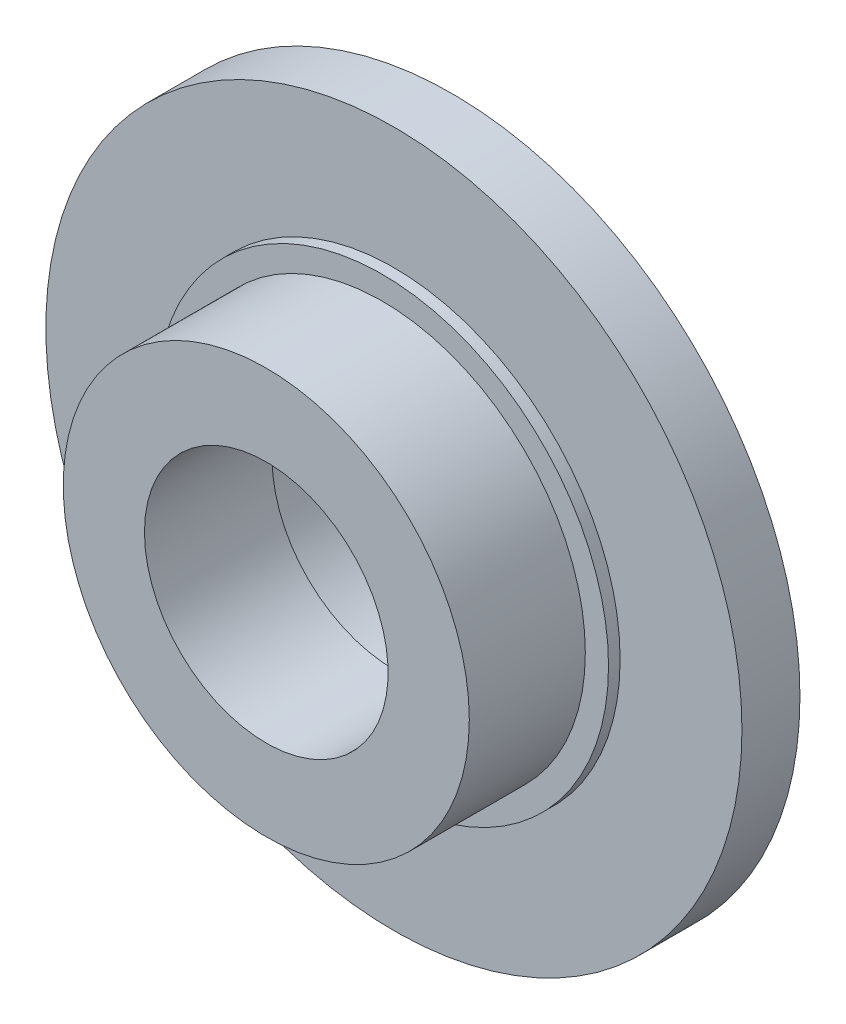
ISO-10303-21;
HEADER;
FILE_DESCRIPTION(('STEP AP214'),'2;1');
FILE_NAME('part.step','',(''),(''),'','','');
FILE_SCHEMA(('AUTOMOTIVE_DESIGN { 1 0 10303 214 1 1 1 1 }'));
ENDSEC;
DATA;
#1=APPLICATION_CONTEXT('core data for automotive mechanical design processes');
#2=APPLICATION_PROTOCOL_DEFINITION('international standard','automotive_design',2000,#1);
#3=PRODUCT_CONTEXT('',#1,'mechanical');
#4=PRODUCT('Part','Part','',(#3));
#5=PRODUCT_RELATED_PRODUCT_CATEGORY('part','',(#4));
#6=PRODUCT_DEFINITION_FORMATION('','',#4);
#7=PRODUCT_DEFINITION_CONTEXT('part definition',#1,'design');
#8=PRODUCT_DEFINITION('design','',#6,#7);
#9=PRODUCT_DEFINITION_SHAPE('','',#8);
#10=(LENGTH_UNIT() NAMED_UNIT(*) SI_UNIT(.MILLI.,.METRE.));
#11=(NAMED_UNIT(*) PLANE_ANGLE_UNIT() SI_UNIT($,.RADIAN.));
#12=(NAMED_UNIT(*) SI_UNIT($,.STERADIAN.) SOLID_ANGLE_UNIT());
#13=UNCERTAINTY_MEASURE_WITH_UNIT(LENGTH_MEASURE(1.E-05),#10,'distance_accuracy_value','');
#14=(GEOMETRIC_REPRESENTATION_CONTEXT(3) GLOBAL_UNCERTAINTY_ASSIGNED_CONTEXT((#13)) GLOBAL_UNIT_ASSIGNED_CONTEXT((#10,
#11,#12)) REPRESENTATION_CONTEXT('',''));
#15=CARTESIAN_POINT('',(0.,0.,0.));
#16=DIRECTION('',(0.,0.,1.));
#17=DIRECTION('',(1.,0.,0.));
#18=AXIS2_PLACEMENT_3D('',#15,#16,#17);
#19=CARTESIAN_POINT('',(0.,0.,5.));
#20=DIRECTION('',(0.,0.,-1.));
#21=DIRECTION('',(-1.,0.,0.));
#22=AXIS2_PLACEMENT_3D('',#19,#20,#21);
#23=CYLINDRICAL_SURFACE('',#22,30.);
#24=CARTESIAN_POINT('',(0.,0.,5.));
#25=DIRECTION('',(0.,0.,1.));
#26=DIRECTION('',(1.,0.,0.));
#27=AXIS2_PLACEMENT_3D('',#24,#25,#26);
#28=CIRCLE('',#27,30.);
#29=CARTESIAN_POINT('',(30.,0.,5.));
#30=VERTEX_POINT('',#29);
#31=EDGE_CURVE('E48',#30,#30,#28,.T.);
#32=ORIENTED_EDGE('',*,*,#31,.F.);
#33=EDGE_LOOP('',(#32));
#34=FACE_BOUND('',#33,.T.);
#35=CARTESIAN_POINT('',(0.,0.,0.));
#36=DIRECTION('',(0.,0.,1.));
#37=DIRECTION('',(1.,0.,0.));
#38=AXIS2_PLACEMENT_3D('',#35,#36,#37);
#39=CIRCLE('',#38,30.);
#40=CARTESIAN_POINT('',(30.,0.,0.));
#41=VERTEX_POINT('',#40);
#42=EDGE_CURVE('E56',#41,#41,#39,.T.);
#43=ORIENTED_EDGE('',*,*,#42,.T.);
#44=EDGE_LOOP('',(#43));
#45=FACE_BOUND('',#44,.T.);
#46=ADVANCED_FACE('F36',(#34,#45),#23,.T.);
#47=CARTESIAN_POINT('',(0.,0.,5.));
#48=DIRECTION('',(0.,0.,1.));
#49=DIRECTION('',(1.,0.,0.));
#50=AXIS2_PLACEMENT_3D('',#47,#48,#49);
#51=PLANE('',#50);
#52=CARTESIAN_POINT('',(0.,0.,5.));
#53=DIRECTION('',(0.,0.,1.));
#54=DIRECTION('',(1.,0.,0.));
#55=AXIS2_PLACEMENT_3D('',#52,#53,#54);
#56=CIRCLE('',#55,19.5);
#57=CARTESIAN_POINT('',(19.5,0.,5.));
#58=VERTEX_POINT('',#57);
#59=EDGE_CURVE('E43',#58,#58,#56,.T.);
#60=ORIENTED_EDGE('',*,*,#59,.F.);
#61=EDGE_LOOP('',(#60));
#62=FACE_BOUND('',#61,.T.);
#63=ORIENTED_EDGE('',*,*,#31,.T.);
#64=EDGE_LOOP('',(#63));
#65=FACE_BOUND('',#64,.T.);
#66=ADVANCED_FACE('F101',(#62,#65),#51,.T.);
#67=CARTESIAN_POINT('',(0.,0.,0.));
#68=DIRECTION('',(0.,0.,1.));
#69=DIRECTION('',(1.,0.,0.));
#70=AXIS2_PLACEMENT_3D('',#67,#68,#69);
#71=PLANE('',#70);
#72=CARTESIAN_POINT('',(0.,0.,0.));
#73=DIRECTION('',(0.,0.,-1.));
#74=DIRECTION('',(-1.,0.,0.));
#75=AXIS2_PLACEMENT_3D('',#72,#73,#74);
#76=CIRCLE('',#75,12.025);
#77=CARTESIAN_POINT('',(-12.025,0.,0.));
#78=VERTEX_POINT('',#77);
#79=EDGE_CURVE('E123',#78,#78,#76,.T.);
#80=ORIENTED_EDGE('',*,*,#79,.F.);
#81=EDGE_LOOP('',(#80));
#82=FACE_BOUND('',#81,.T.);
#83=CARTESIAN_POINT('',(24.5,0.,0.));
#84=DIRECTION('',(0.,0.,1.));
#85=DIRECTION('',(1.,0.,0.));
#86=AXIS2_PLACEMENT_3D('',#83,#84,#85);
#87=CIRCLE('',#86,2.05);
#88=CARTESIAN_POINT('',(26.55,0.,0.));
#89=VERTEX_POINT('',#88);
#90=EDGE_CURVE('E39',#89,#89,#87,.F.);
#91=ORIENTED_EDGE('',*,*,#90,.F.);
#92=EDGE_LOOP('',(#91));
#93=FACE_BOUND('',#92,.T.);
#94=CARTESIAN_POINT('',(12.2500000000002,21.2176223927186,0.));
#95=DIRECTION('',(0.,0.,1.));
#96=DIRECTION('',(1.,0.,0.));
#97=AXIS2_PLACEMENT_3D('',#94,#95,#96);
#98=CIRCLE('',#97,2.05);
#99=CARTESIAN_POINT('',(14.3000000000002,21.2176223927186,0.));
#100=VERTEX_POINT('',#99);
#101=EDGE_CURVE('E74',#100,#100,#98,.F.);
#102=ORIENTED_EDGE('',*,*,#101,.F.);
#103=EDGE_LOOP('',(#102));
#104=FACE_BOUND('',#103,.T.);
#105=CARTESIAN_POINT('',(-12.2499999999998,21.2176223927189,0.));
#106=DIRECTION('',(0.,0.,1.));
#107=DIRECTION('',(1.,0.,0.));
#108=AXIS2_PLACEMENT_3D('',#105,#106,#107);
#109=CIRCLE('',#108,2.05);
#110=CARTESIAN_POINT('',(-10.1999999999998,21.2176223927189,0.));
#111=VERTEX_POINT('',#110);
#112=EDGE_CURVE('E72',#111,#111,#109,.F.);
#113=ORIENTED_EDGE('',*,*,#112,.F.);
#114=EDGE_LOOP('',(#113));
#115=FACE_BOUND('',#114,.T.);
#116=CARTESIAN_POINT('',(-24.5,1.71082585603314E-13,0.));
#117=DIRECTION('',(0.,0.,1.));
#118=DIRECTION('',(1.,0.,0.));
#119=AXIS2_PLACEMENT_3D('',#116,#117,#118);
#120=CIRCLE('',#119,2.05);
#121=CARTESIAN_POINT('',(-22.45,1.71082585603314E-13,0.));
#122=VERTEX_POINT('',#121);
#123=EDGE_CURVE('E69',#122,#122,#120,.F.);
#124=ORIENTED_EDGE('',*,*,#123,.F.);
#125=EDGE_LOOP('',(#124));
#126=FACE_BOUND('',#125,.T.);
#127=CARTESIAN_POINT('',(-12.2500000000001,-21.2176223927187,0.));
#128=DIRECTION('',(0.,0.,1.));
#129=DIRECTION('',(1.,0.,0.));
#130=AXIS2_PLACEMENT_3D('',#127,#128,#129);
#131=CIRCLE('',#130,2.05);
#132=CARTESIAN_POINT('',(-10.2000000000001,-21.2176223927187,0.));
#133=VERTEX_POINT('',#132);
#134=EDGE_CURVE('E65',#133,#133,#131,.F.);
#135=ORIENTED_EDGE('',*,*,#134,.F.);
#136=EDGE_LOOP('',(#135));
#137=FACE_BOUND('',#136,.T.);
#138=CARTESIAN_POINT('',(12.25,-21.2176223927188,0.));
#139=DIRECTION('',(0.,0.,1.));
#140=DIRECTION('',(1.,0.,0.));
#141=AXIS2_PLACEMENT_3D('',#138,#139,#140);
#142=CIRCLE('',#141,2.05);
#143=CARTESIAN_POINT('',(14.3,-21.2176223927188,0.));
#144=VERTEX_POINT('',#143);
#145=EDGE_CURVE('E62',#144,#144,#142,.F.);
#146=ORIENTED_EDGE('',*,*,#145,.F.);
#147=EDGE_LOOP('',(#146));
#148=FACE_BOUND('',#147,.T.);
#149=ORIENTED_EDGE('',*,*,#42,.F.);
#150=EDGE_LOOP('',(#149));
#151=FACE_BOUND('',#150,.T.);
#152=ADVANCED_FACE('F106',(#82,#93,#104,#115,#126,#137,#148,#151),#71,.F.);
#153=CARTESIAN_POINT('',(0.,0.,6.));
#154=DIRECTION('',(0.,0.,-1.));
#155=DIRECTION('',(-1.,0.,0.));
#156=AXIS2_PLACEMENT_3D('',#153,#154,#155);
#157=CYLINDRICAL_SURFACE('',#156,19.5);
#158=CARTESIAN_POINT('',(0.,0.,6.));
#159=DIRECTION('',(0.,0.,1.));
#160=DIRECTION('',(1.,0.,0.));
#161=AXIS2_PLACEMENT_3D('',#158,#159,#160);
#162=CIRCLE('',#161,19.5);
#163=CARTESIAN_POINT('',(19.5,0.,6.));
#164=VERTEX_POINT('',#163);
#165=EDGE_CURVE('E54',#164,#164,#162,.T.);
#166=ORIENTED_EDGE('',*,*,#165,.F.);
#167=EDGE_LOOP('',(#166));
#168=FACE_BOUND('',#167,.T.);
#169=ORIENTED_EDGE('',*,*,#59,.T.);
#170=EDGE_LOOP('',(#169));
#171=FACE_BOUND('',#170,.T.);
#172=ADVANCED_FACE('F97',(#168,#171),#157,.T.);
#173=CARTESIAN_POINT('',(0.,0.,6.));
#174=DIRECTION('',(0.,0.,1.));
#175=DIRECTION('',(1.,0.,0.));
#176=AXIS2_PLACEMENT_3D('',#173,#174,#175);
#177=PLANE('',#176);
#178=CARTESIAN_POINT('',(0.,0.,6.));
#179=DIRECTION('',(0.,0.,1.));
#180=DIRECTION('',(1.,0.,0.));
#181=AXIS2_PLACEMENT_3D('',#178,#179,#180);
#182=CIRCLE('',#181,17.5);
#183=CARTESIAN_POINT('',(17.5,0.,6.));
#184=VERTEX_POINT('',#183);
#185=EDGE_CURVE('E10',#184,#184,#182,.T.);
#186=ORIENTED_EDGE('',*,*,#185,.F.);
#187=EDGE_LOOP('',(#186));
#188=FACE_BOUND('',#187,.T.);
#189=ORIENTED_EDGE('',*,*,#165,.T.);
#190=EDGE_LOOP('',(#189));
#191=FACE_BOUND('',#190,.T.);
#192=ADVANCED_FACE('F88',(#188,#191),#177,.T.);
#193=CARTESIAN_POINT('',(0.,0.,16.));
#194=DIRECTION('',(0.,0.,-1.));
#195=DIRECTION('',(-1.,0.,0.));
#196=AXIS2_PLACEMENT_3D('',#193,#194,#195);
#197=CYLINDRICAL_SURFACE('',#196,17.5);
#198=CARTESIAN_POINT('',(0.,0.,16.));
#199=DIRECTION('',(0.,0.,1.));
#200=DIRECTION('',(1.,0.,0.));
#201=AXIS2_PLACEMENT_3D('',#198,#199,#200);
#202=CIRCLE('',#201,17.5);
#203=CARTESIAN_POINT('',(17.5,0.,16.));
#204=VERTEX_POINT('',#203);
#205=EDGE_CURVE('E52',#204,#204,#202,.T.);
#206=ORIENTED_EDGE('',*,*,#205,.F.);
#207=EDGE_LOOP('',(#206));
#208=FACE_BOUND('',#207,.T.);
#209=ORIENTED_EDGE('',*,*,#185,.T.);
#210=EDGE_LOOP('',(#209));
#211=FACE_BOUND('',#210,.T.);
#212=ADVANCED_FACE('F86',(#208,#211),#197,.T.);
#213=CARTESIAN_POINT('',(0.,0.,16.));
#214=DIRECTION('',(0.,0.,1.));
#215=DIRECTION('',(1.,0.,0.));
#216=AXIS2_PLACEMENT_3D('',#213,#214,#215);
#217=PLANE('',#216);
#218=CARTESIAN_POINT('',(0.,0.,16.));
#219=DIRECTION('',(0.,0.,-1.));
#220=DIRECTION('',(-1.,0.,0.));
#221=AXIS2_PLACEMENT_3D('',#218,#219,#220);
#222=CIRCLE('',#221,10.5);
#223=CARTESIAN_POINT('',(-10.5,0.,16.));
#224=VERTEX_POINT('',#223);
#225=EDGE_CURVE('E192',#224,#224,#222,.T.);
#226=ORIENTED_EDGE('',*,*,#225,.T.);
#227=EDGE_LOOP('',(#226));
#228=FACE_BOUND('',#227,.T.);
#229=ORIENTED_EDGE('',*,*,#205,.T.);
#230=EDGE_LOOP('',(#229));
#231=FACE_BOUND('',#230,.T.);
#232=ADVANCED_FACE('F84',(#228,#231),#217,.T.);
#233=CARTESIAN_POINT('',(12.25,-21.2176223927188,4.));
#234=DIRECTION('',(0.,0.,-1.));
#235=DIRECTION('',(-1.,0.,0.));
#236=AXIS2_PLACEMENT_3D('',#233,#234,#235);
#237=CYLINDRICAL_SURFACE('',#236,2.05);
#238=CARTESIAN_POINT('',(12.25,-21.2176223927188,4.));
#239=DIRECTION('',(0.,0.,1.));
#240=DIRECTION('',(1.,0.,0.));
#241=AXIS2_PLACEMENT_3D('',#238,#239,#240);
#242=CIRCLE('',#241,2.05);
#243=CARTESIAN_POINT('',(14.3,-21.2176223927188,4.));
#244=VERTEX_POINT('',#243);
#245=EDGE_CURVE('E187',#244,#244,#242,.T.);
#246=ORIENTED_EDGE('',*,*,#245,.T.);
#247=EDGE_LOOP('',(#246));
#248=FACE_BOUND('',#247,.T.);
#249=ORIENTED_EDGE('',*,*,#145,.T.);
#250=EDGE_LOOP('',(#249));
#251=FACE_BOUND('',#250,.T.);
#252=ADVANCED_FACE('F94',(#248,#251),#237,.F.);
#253=CARTESIAN_POINT('',(12.25,-21.2176223927188,4.));
#254=DIRECTION('',(0.,0.,1.));
#255=DIRECTION('',(1.,0.,0.));
#256=AXIS2_PLACEMENT_3D('',#253,#254,#255);
#257=PLANE('',#256);
#258=ORIENTED_EDGE('',*,*,#245,.F.);
#259=EDGE_LOOP('',(#258));
#260=FACE_BOUND('',#259,.T.);
#261=ADVANCED_FACE('F135',(#260),#257,.F.);
#262=CARTESIAN_POINT('',(-12.2500000000001,-21.2176223927187,4.));
#263=DIRECTION('',(0.,0.,-1.));
#264=DIRECTION('',(-1.,0.,0.));
#265=AXIS2_PLACEMENT_3D('',#262,#263,#264);
#266=CYLINDRICAL_SURFACE('',#265,2.05);
#267=CARTESIAN_POINT('',(-12.2500000000001,-21.2176223927187,4.));
#268=DIRECTION('',(0.,0.,1.));
#269=DIRECTION('',(1.,0.,0.));
#270=AXIS2_PLACEMENT_3D('',#267,#268,#269);
#271=CIRCLE('',#270,2.05);
#272=CARTESIAN_POINT('',(-10.2000000000001,-21.2176223927187,4.));
#273=VERTEX_POINT('',#272);
#274=EDGE_CURVE('E179',#273,#273,#271,.T.);
#275=ORIENTED_EDGE('',*,*,#274,.T.);
#276=EDGE_LOOP('',(#275));
#277=FACE_BOUND('',#276,.T.);
#278=ORIENTED_EDGE('',*,*,#134,.T.);
#279=EDGE_LOOP('',(#278));
#280=FACE_BOUND('',#279,.T.);
#281=ADVANCED_FACE('F141',(#277,#280),#266,.F.);
#282=CARTESIAN_POINT('',(-12.2500000000001,-21.2176223927187,4.));
#283=DIRECTION('',(0.,0.,1.));
#284=DIRECTION('',(1.,0.,0.));
#285=AXIS2_PLACEMENT_3D('',#282,#283,#284);
#286=PLANE('',#285);
#287=ORIENTED_EDGE('',*,*,#274,.F.);
#288=EDGE_LOOP('',(#287));
#289=FACE_BOUND('',#288,.T.);
#290=ADVANCED_FACE('F147',(#289),#286,.F.);
#291=CARTESIAN_POINT('',(-24.5,1.71082585603314E-13,4.));
#292=DIRECTION('',(0.,0.,-1.));
#293=DIRECTION('',(-1.,0.,0.));
#294=AXIS2_PLACEMENT_3D('',#291,#292,#293);
#295=CYLINDRICAL_SURFACE('',#294,2.05);
#296=CARTESIAN_POINT('',(-24.5,1.71082585603314E-13,4.));
#297=DIRECTION('',(0.,0.,1.));
#298=DIRECTION('',(1.,0.,0.));
#299=AXIS2_PLACEMENT_3D('',#296,#297,#298);
#300=CIRCLE('',#299,2.05);
#301=CARTESIAN_POINT('',(-22.45,1.71082585603314E-13,4.));
#302=VERTEX_POINT('',#301);
#303=EDGE_CURVE('E176',#302,#302,#300,.T.);
#304=ORIENTED_EDGE('',*,*,#303,.T.);
#305=EDGE_LOOP('',(#304));
#306=FACE_BOUND('',#305,.T.);
#307=ORIENTED_EDGE('',*,*,#123,.T.);
#308=EDGE_LOOP('',(#307));
#309=FACE_BOUND('',#308,.T.);
#310=ADVANCED_FACE('F150',(#306,#309),#295,.F.);
#311=CARTESIAN_POINT('',(-24.5,1.71082585603314E-13,4.));
#312=DIRECTION('',(0.,0.,1.));
#313=DIRECTION('',(1.,0.,0.));
#314=AXIS2_PLACEMENT_3D('',#311,#312,#313);
#315=PLANE('',#314);
#316=ORIENTED_EDGE('',*,*,#303,.F.);
#317=EDGE_LOOP('',(#316));
#318=FACE_BOUND('',#317,.T.);
#319=ADVANCED_FACE('F155',(#318),#315,.F.);
#320=CARTESIAN_POINT('',(-12.2499999999998,21.2176223927189,4.));
#321=DIRECTION('',(0.,0.,-1.));
#322=DIRECTION('',(-1.,0.,0.));
#323=AXIS2_PLACEMENT_3D('',#320,#321,#322);
#324=CYLINDRICAL_SURFACE('',#323,2.05);
#325=CARTESIAN_POINT('',(-12.2499999999998,21.2176223927189,4.));
#326=DIRECTION('',(0.,0.,1.));
#327=DIRECTION('',(1.,0.,0.));
#328=AXIS2_PLACEMENT_3D('',#325,#326,#327);
#329=CIRCLE('',#328,2.05);
#330=CARTESIAN_POINT('',(-10.1999999999998,21.2176223927189,4.));
#331=VERTEX_POINT('',#330);
#332=EDGE_CURVE('E175',#331,#331,#329,.T.);
#333=ORIENTED_EDGE('',*,*,#332,.T.);
#334=EDGE_LOOP('',(#333));
#335=FACE_BOUND('',#334,.T.);
#336=ORIENTED_EDGE('',*,*,#112,.T.);
#337=EDGE_LOOP('',(#336));
#338=FACE_BOUND('',#337,.T.);
#339=ADVANCED_FACE('F158',(#335,#338),#324,.F.);
#340=CARTESIAN_POINT('',(-12.2499999999998,21.2176223927189,4.));
#341=DIRECTION('',(0.,0.,1.));
#342=DIRECTION('',(1.,0.,0.));
#343=AXIS2_PLACEMENT_3D('',#340,#341,#342);
#344=PLANE('',#343);
#345=ORIENTED_EDGE('',*,*,#332,.F.);
#346=EDGE_LOOP('',(#345));
#347=FACE_BOUND('',#346,.T.);
#348=ADVANCED_FACE('F163',(#347),#344,.F.);
#349=CARTESIAN_POINT('',(12.2500000000002,21.2176223927186,4.));
#350=DIRECTION('',(0.,0.,-1.));
#351=DIRECTION('',(-1.,0.,0.));
#352=AXIS2_PLACEMENT_3D('',#349,#350,#351);
#353=CYLINDRICAL_SURFACE('',#352,2.05);
#354=CARTESIAN_POINT('',(12.2500000000002,21.2176223927186,4.));
#355=DIRECTION('',(0.,0.,1.));
#356=DIRECTION('',(1.,0.,0.));
#357=AXIS2_PLACEMENT_3D('',#354,#355,#356);
#358=CIRCLE('',#357,2.05);
#359=CARTESIAN_POINT('',(14.3000000000002,21.2176223927186,4.));
#360=VERTEX_POINT('',#359);
#361=EDGE_CURVE('E177',#360,#360,#358,.T.);
#362=ORIENTED_EDGE('',*,*,#361,.T.);
#363=EDGE_LOOP('',(#362));
#364=FACE_BOUND('',#363,.T.);
#365=ORIENTED_EDGE('',*,*,#101,.T.);
#366=EDGE_LOOP('',(#365));
#367=FACE_BOUND('',#366,.T.);
#368=ADVANCED_FACE('F166',(#364,#367),#353,.F.);
#369=CARTESIAN_POINT('',(12.2500000000002,21.2176223927186,4.));
#370=DIRECTION('',(0.,0.,1.));
#371=DIRECTION('',(1.,0.,0.));
#372=AXIS2_PLACEMENT_3D('',#369,#370,#371);
#373=PLANE('',#372);
#374=ORIENTED_EDGE('',*,*,#361,.F.);
#375=EDGE_LOOP('',(#374));
#376=FACE_BOUND('',#375,.T.);
#377=ADVANCED_FACE('F227',(#376),#373,.F.);
#378=CARTESIAN_POINT('',(24.5,0.,4.));
#379=DIRECTION('',(0.,0.,-1.));
#380=DIRECTION('',(-1.,0.,0.));
#381=AXIS2_PLACEMENT_3D('',#378,#379,#380);
#382=CYLINDRICAL_SURFACE('',#381,2.05);
#383=CARTESIAN_POINT('',(24.5,0.,4.));
#384=DIRECTION('',(0.,0.,1.));
#385=DIRECTION('',(1.,0.,0.));
#386=AXIS2_PLACEMENT_3D('',#383,#384,#385);
#387=CIRCLE('',#386,2.05);
#388=CARTESIAN_POINT('',(26.55,0.,4.));
#389=VERTEX_POINT('',#388);
#390=EDGE_CURVE('E66',#389,#389,#387,.T.);
#391=ORIENTED_EDGE('',*,*,#390,.T.);
#392=EDGE_LOOP('',(#391));
#393=FACE_BOUND('',#392,.T.);
#394=ORIENTED_EDGE('',*,*,#90,.T.);
#395=EDGE_LOOP('',(#394));
#396=FACE_BOUND('',#395,.T.);
#397=ADVANCED_FACE('F221',(#393,#396),#382,.F.);
#398=CARTESIAN_POINT('',(24.5,0.,4.));
#399=DIRECTION('',(0.,0.,1.));
#400=DIRECTION('',(1.,0.,0.));
#401=AXIS2_PLACEMENT_3D('',#398,#399,#400);
#402=PLANE('',#401);
#403=ORIENTED_EDGE('',*,*,#390,.F.);
#404=EDGE_LOOP('',(#403));
#405=FACE_BOUND('',#404,.T.);
#406=ADVANCED_FACE('F216',(#405),#402,.F.);
#407=CARTESIAN_POINT('',(0.,0.,5.));
#408=DIRECTION('',(0.,0.,-1.));
#409=DIRECTION('',(-1.,0.,0.));
#410=AXIS2_PLACEMENT_3D('',#407,#408,#409);
#411=CYLINDRICAL_SURFACE('',#410,12.025);
#412=CARTESIAN_POINT('',(0.,0.,5.));
#413=DIRECTION('',(0.,0.,-1.));
#414=DIRECTION('',(-1.,0.,0.));
#415=AXIS2_PLACEMENT_3D('',#412,#413,#414);
#416=CIRCLE('',#415,12.025);
#417=CARTESIAN_POINT('',(-12.025,0.,5.));
#418=VERTEX_POINT('',#417);
#419=EDGE_CURVE('E182',#418,#418,#416,.T.);
#420=ORIENTED_EDGE('',*,*,#419,.F.);
#421=EDGE_LOOP('',(#420));
#422=FACE_BOUND('',#421,.T.);
#423=ORIENTED_EDGE('',*,*,#79,.T.);
#424=EDGE_LOOP('',(#423));
#425=FACE_BOUND('',#424,.T.);
#426=ADVANCED_FACE('F210',(#422,#425),#411,.F.);
#427=CARTESIAN_POINT('',(0.,0.,5.));
#428=DIRECTION('',(0.,0.,-1.));
#429=DIRECTION('',(-1.,0.,0.));
#430=AXIS2_PLACEMENT_3D('',#427,#428,#429);
#431=PLANE('',#430);
#432=CARTESIAN_POINT('',(0.,0.,5.));
#433=DIRECTION('',(0.,0.,-1.));
#434=DIRECTION('',(-1.,0.,0.));
#435=AXIS2_PLACEMENT_3D('',#432,#433,#434);
#436=CIRCLE('',#435,10.5);
#437=CARTESIAN_POINT('',(-10.5,0.,5.));
#438=VERTEX_POINT('',#437);
#439=EDGE_CURVE('E195',#438,#438,#436,.T.);
#440=ORIENTED_EDGE('',*,*,#439,.F.);
#441=EDGE_LOOP('',(#440));
#442=FACE_BOUND('',#441,.T.);
#443=ORIENTED_EDGE('',*,*,#419,.T.);
#444=EDGE_LOOP('',(#443));
#445=FACE_BOUND('',#444,.T.);
#446=ADVANCED_FACE('F204',(#442,#445),#431,.T.);
#447=CARTESIAN_POINT('',(0.,0.,16.));
#448=DIRECTION('',(0.,0.,-1.));
#449=DIRECTION('',(-1.,0.,0.));
#450=AXIS2_PLACEMENT_3D('',#447,#448,#449);
#451=CYLINDRICAL_SURFACE('',#450,10.5);
#452=ORIENTED_EDGE('',*,*,#225,.F.);
#453=EDGE_LOOP('',(#452));
#454=FACE_BOUND('',#453,.T.);
#455=ORIENTED_EDGE('',*,*,#439,.T.);
#456=EDGE_LOOP('',(#455));
#457=FACE_BOUND('',#456,.T.);
#458=ADVANCED_FACE('F201',(#454,#457),#451,.F.);
#459=CLOSED_SHELL('',(#46,#66,#152,#172,#192,#212,#232,#252,#261,#281,#290,#310,#319,#339,#348,
#368,#377,#397,#406,#426,#446,#458));
#460=MANIFOLD_SOLID_BREP('B2',#459);
#461=ADVANCED_BREP_SHAPE_REPRESENTATION('',(#18,#460),#14);
#462=SHAPE_DEFINITION_REPRESENTATION(#9,#461);
ENDSEC;
END-ISO-10303-21;
